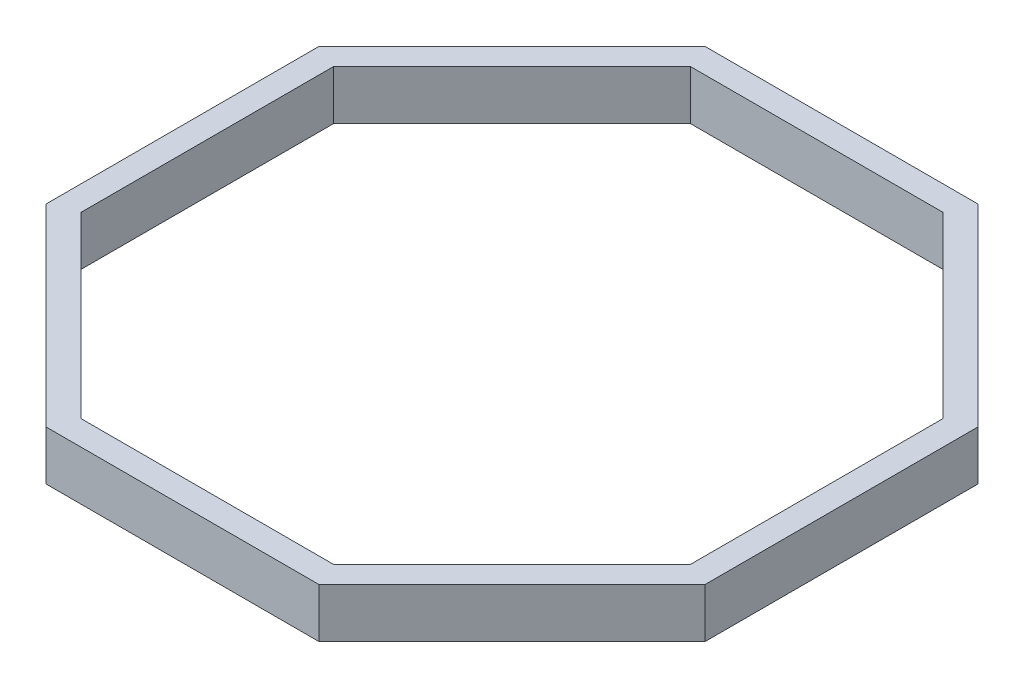
ISO-10303-21;
HEADER;
FILE_DESCRIPTION(('STEP AP214'),'2;1');
FILE_NAME('part.step','',(''),(''),'','','');
FILE_SCHEMA(('AUTOMOTIVE_DESIGN { 1 0 10303 214 1 1 1 1 }'));
ENDSEC;
DATA;
#1=APPLICATION_CONTEXT('core data for automotive mechanical design processes');
#2=APPLICATION_PROTOCOL_DEFINITION('international standard','automotive_design',2000,#1);
#3=PRODUCT_CONTEXT('',#1,'mechanical');
#4=PRODUCT('Part','Part','',(#3));
#5=PRODUCT_RELATED_PRODUCT_CATEGORY('part','',(#4));
#6=PRODUCT_DEFINITION_FORMATION('','',#4);
#7=PRODUCT_DEFINITION_CONTEXT('part definition',#1,'design');
#8=PRODUCT_DEFINITION('design','',#6,#7);
#9=PRODUCT_DEFINITION_SHAPE('','',#8);
#10=(LENGTH_UNIT() NAMED_UNIT(*) SI_UNIT(.MILLI.,.METRE.));
#11=(NAMED_UNIT(*) PLANE_ANGLE_UNIT() SI_UNIT($,.RADIAN.));
#12=(NAMED_UNIT(*) SI_UNIT($,.STERADIAN.) SOLID_ANGLE_UNIT());
#13=UNCERTAINTY_MEASURE_WITH_UNIT(LENGTH_MEASURE(1.E-05),#10,'distance_accuracy_value','');
#14=(GEOMETRIC_REPRESENTATION_CONTEXT(3) GLOBAL_UNCERTAINTY_ASSIGNED_CONTEXT((#13)) GLOBAL_UNIT_ASSIGNED_CONTEXT((#10,
#11,#12)) REPRESENTATION_CONTEXT('',''));
#15=CARTESIAN_POINT('',(0.,0.,0.));
#16=DIRECTION('',(0.,0.,1.));
#17=DIRECTION('',(1.,0.,0.));
#18=AXIS2_PLACEMENT_3D('',#15,#16,#17);
#19=CARTESIAN_POINT('',(200.,30.,82.8427124746187));
#20=DIRECTION('',(-1.,0.,0.));
#21=DIRECTION('',(0.,0.,1.));
#22=AXIS2_PLACEMENT_3D('',#19,#20,#21);
#23=PLANE('',#22);
#24=DIRECTION('',(0.,0.,-1.));
#25=VECTOR('',#24,1.);
#26=CARTESIAN_POINT('',(200.,0.,82.8427124746187));
#27=LINE('',#26,#25);
#28=CARTESIAN_POINT('',(200.,0.,82.8427124746187));
#29=VERTEX_POINT('',#28);
#30=CARTESIAN_POINT('',(199.999999999999,0.,-82.8427124746189));
#31=VERTEX_POINT('',#30);
#32=EDGE_CURVE('E204',#29,#31,#27,.T.);
#33=ORIENTED_EDGE('',*,*,#32,.T.);
#34=DIRECTION('',(0.,-1.,0.));
#35=VECTOR('',#34,1.);
#36=CARTESIAN_POINT('',(199.999999999999,30.,-82.8427124746189));
#37=LINE('',#36,#35);
#38=CARTESIAN_POINT('',(199.999999999999,30.,-82.8427124746189));
#39=VERTEX_POINT('',#38);
#40=EDGE_CURVE('E11',#39,#31,#37,.T.);
#41=ORIENTED_EDGE('',*,*,#40,.F.);
#42=DIRECTION('',(0.,0.,-1.));
#43=VECTOR('',#42,1.);
#44=CARTESIAN_POINT('',(200.,30.,82.8427124746187));
#45=LINE('',#44,#43);
#46=CARTESIAN_POINT('',(200.,30.,82.8427124746187));
#47=VERTEX_POINT('',#46);
#48=EDGE_CURVE('E216',#47,#39,#45,.T.);
#49=ORIENTED_EDGE('',*,*,#48,.F.);
#50=DIRECTION('',(0.,-1.,0.));
#51=VECTOR('',#50,1.);
#52=CARTESIAN_POINT('',(200.,30.,82.8427124746187));
#53=LINE('',#52,#51);
#54=EDGE_CURVE('E234',#47,#29,#53,.T.);
#55=ORIENTED_EDGE('',*,*,#54,.T.);
#56=EDGE_LOOP('',(#33,#41,#49,#55));
#57=FACE_BOUND('',#56,.T.);
#58=ADVANCED_FACE('F35',(#57),#23,.F.);
#59=CARTESIAN_POINT('',(199.999999999999,30.,-82.8427124746189));
#60=DIRECTION('',(-0.707106781186547,0.,0.707106781186548));
#61=DIRECTION('',(0.707106781186548,0.,0.707106781186547));
#62=AXIS2_PLACEMENT_3D('',#59,#60,#61);
#63=PLANE('',#62);
#64=DIRECTION('',(-0.707106781186548,0.,-0.707106781186547));
#65=VECTOR('',#64,1.);
#66=CARTESIAN_POINT('',(199.999999999999,0.,-82.8427124746189));
#67=LINE('',#66,#65);
#68=CARTESIAN_POINT('',(82.8427124746187,0.,-200.));
#69=VERTEX_POINT('',#68);
#70=EDGE_CURVE('E237',#31,#69,#67,.T.);
#71=ORIENTED_EDGE('',*,*,#70,.T.);
#72=DIRECTION('',(0.,-1.,0.));
#73=VECTOR('',#72,1.);
#74=CARTESIAN_POINT('',(82.8427124746187,30.,-200.));
#75=LINE('',#74,#73);
#76=CARTESIAN_POINT('',(82.8427124746187,30.,-200.));
#77=VERTEX_POINT('',#76);
#78=EDGE_CURVE('E42',#77,#69,#75,.T.);
#79=ORIENTED_EDGE('',*,*,#78,.F.);
#80=DIRECTION('',(-0.707106781186548,0.,-0.707106781186547));
#81=VECTOR('',#80,1.);
#82=CARTESIAN_POINT('',(199.999999999999,30.,-82.8427124746189));
#83=LINE('',#82,#81);
#84=EDGE_CURVE('E219',#39,#77,#83,.T.);
#85=ORIENTED_EDGE('',*,*,#84,.F.);
#86=ORIENTED_EDGE('',*,*,#40,.T.);
#87=EDGE_LOOP('',(#71,#79,#85,#86));
#88=FACE_BOUND('',#87,.T.);
#89=ADVANCED_FACE('F292',(#88),#63,.F.);
#90=CARTESIAN_POINT('',(82.8427124746187,30.,-200.));
#91=DIRECTION('',(0.,0.,1.));
#92=DIRECTION('',(1.,0.,0.));
#93=AXIS2_PLACEMENT_3D('',#90,#91,#92);
#94=PLANE('',#93);
#95=DIRECTION('',(-1.,0.,0.));
#96=VECTOR('',#95,1.);
#97=CARTESIAN_POINT('',(82.8427124746187,0.,-200.));
#98=LINE('',#97,#96);
#99=CARTESIAN_POINT('',(-82.8427124746191,0.,-199.999999999999));
#100=VERTEX_POINT('',#99);
#101=EDGE_CURVE('E239',#69,#100,#98,.T.);
#102=ORIENTED_EDGE('',*,*,#101,.T.);
#103=DIRECTION('',(0.,-1.,0.));
#104=VECTOR('',#103,1.);
#105=CARTESIAN_POINT('',(-82.8427124746191,30.,-199.999999999999));
#106=LINE('',#105,#104);
#107=CARTESIAN_POINT('',(-82.8427124746191,30.,-199.999999999999));
#108=VERTEX_POINT('',#107);
#109=EDGE_CURVE('E264',#108,#100,#106,.T.);
#110=ORIENTED_EDGE('',*,*,#109,.F.);
#111=DIRECTION('',(-1.,0.,0.));
#112=VECTOR('',#111,1.);
#113=CARTESIAN_POINT('',(82.8427124746187,30.,-200.));
#114=LINE('',#113,#112);
#115=EDGE_CURVE('E222',#77,#108,#114,.T.);
#116=ORIENTED_EDGE('',*,*,#115,.F.);
#117=ORIENTED_EDGE('',*,*,#78,.T.);
#118=EDGE_LOOP('',(#102,#110,#116,#117));
#119=FACE_BOUND('',#118,.T.);
#120=ADVANCED_FACE('F271',(#119),#94,.F.);
#121=CARTESIAN_POINT('',(-82.8427124746191,30.,-199.999999999999));
#122=DIRECTION('',(0.707106781186548,0.,0.707106781186547));
#123=DIRECTION('',(0.707106781186547,0.,-0.707106781186548));
#124=AXIS2_PLACEMENT_3D('',#121,#122,#123);
#125=PLANE('',#124);
#126=DIRECTION('',(-0.707106781186547,0.,0.707106781186548));
#127=VECTOR('',#126,1.);
#128=CARTESIAN_POINT('',(-82.8427124746191,0.,-199.999999999999));
#129=LINE('',#128,#127);
#130=CARTESIAN_POINT('',(-200.,0.,-82.8427124746187));
#131=VERTEX_POINT('',#130);
#132=EDGE_CURVE('E241',#100,#131,#129,.T.);
#133=ORIENTED_EDGE('',*,*,#132,.T.);
#134=DIRECTION('',(0.,-1.,0.));
#135=VECTOR('',#134,1.);
#136=CARTESIAN_POINT('',(-200.,30.,-82.8427124746187));
#137=LINE('',#136,#135);
#138=CARTESIAN_POINT('',(-200.,30.,-82.8427124746187));
#139=VERTEX_POINT('',#138);
#140=EDGE_CURVE('E261',#139,#131,#137,.T.);
#141=ORIENTED_EDGE('',*,*,#140,.F.);
#142=DIRECTION('',(-0.707106781186547,0.,0.707106781186548));
#143=VECTOR('',#142,1.);
#144=CARTESIAN_POINT('',(-82.8427124746191,30.,-199.999999999999));
#145=LINE('',#144,#143);
#146=EDGE_CURVE('E224',#108,#139,#145,.T.);
#147=ORIENTED_EDGE('',*,*,#146,.F.);
#148=ORIENTED_EDGE('',*,*,#109,.T.);
#149=EDGE_LOOP('',(#133,#141,#147,#148));
#150=FACE_BOUND('',#149,.T.);
#151=ADVANCED_FACE('F280',(#150),#125,.F.);
#152=CARTESIAN_POINT('',(-200.,30.,-82.8427124746187));
#153=DIRECTION('',(1.,0.,0.));
#154=DIRECTION('',(0.,0.,-1.));
#155=AXIS2_PLACEMENT_3D('',#152,#153,#154);
#156=PLANE('',#155);
#157=DIRECTION('',(0.,0.,1.));
#158=VECTOR('',#157,1.);
#159=CARTESIAN_POINT('',(-200.,0.,-82.8427124746187));
#160=LINE('',#159,#158);
#161=CARTESIAN_POINT('',(-199.999999999999,0.,82.842712474619));
#162=VERTEX_POINT('',#161);
#163=EDGE_CURVE('E243',#131,#162,#160,.T.);
#164=ORIENTED_EDGE('',*,*,#163,.T.);
#165=DIRECTION('',(0.,-1.,0.));
#166=VECTOR('',#165,1.);
#167=CARTESIAN_POINT('',(-199.999999999999,30.,82.842712474619));
#168=LINE('',#167,#166);
#169=CARTESIAN_POINT('',(-199.999999999999,30.,82.842712474619));
#170=VERTEX_POINT('',#169);
#171=EDGE_CURVE('E258',#170,#162,#168,.T.);
#172=ORIENTED_EDGE('',*,*,#171,.F.);
#173=DIRECTION('',(0.,0.,1.));
#174=VECTOR('',#173,1.);
#175=CARTESIAN_POINT('',(-200.,30.,-82.8427124746187));
#176=LINE('',#175,#174);
#177=EDGE_CURVE('E226',#139,#170,#176,.T.);
#178=ORIENTED_EDGE('',*,*,#177,.F.);
#179=ORIENTED_EDGE('',*,*,#140,.T.);
#180=EDGE_LOOP('',(#164,#172,#178,#179));
#181=FACE_BOUND('',#180,.T.);
#182=ADVANCED_FACE('F284',(#181),#156,.F.);
#183=CARTESIAN_POINT('',(-199.999999999999,30.,82.842712474619));
#184=DIRECTION('',(0.707106781186547,0.,-0.707106781186548));
#185=DIRECTION('',(-0.707106781186548,0.,-0.707106781186547));
#186=AXIS2_PLACEMENT_3D('',#183,#184,#185);
#187=PLANE('',#186);
#188=DIRECTION('',(0.707106781186548,0.,0.707106781186547));
#189=VECTOR('',#188,1.);
#190=CARTESIAN_POINT('',(-199.999999999999,0.,82.842712474619));
#191=LINE('',#190,#189);
#192=CARTESIAN_POINT('',(-82.8427124746187,0.,200.));
#193=VERTEX_POINT('',#192);
#194=EDGE_CURVE('E245',#162,#193,#191,.T.);
#195=ORIENTED_EDGE('',*,*,#194,.T.);
#196=DIRECTION('',(0.,-1.,0.));
#197=VECTOR('',#196,1.);
#198=CARTESIAN_POINT('',(-82.8427124746187,30.,200.));
#199=LINE('',#198,#197);
#200=CARTESIAN_POINT('',(-82.8427124746187,30.,200.));
#201=VERTEX_POINT('',#200);
#202=EDGE_CURVE('E255',#201,#193,#199,.T.);
#203=ORIENTED_EDGE('',*,*,#202,.F.);
#204=DIRECTION('',(0.707106781186548,0.,0.707106781186547));
#205=VECTOR('',#204,1.);
#206=CARTESIAN_POINT('',(-199.999999999999,30.,82.842712474619));
#207=LINE('',#206,#205);
#208=EDGE_CURVE('E228',#170,#201,#207,.T.);
#209=ORIENTED_EDGE('',*,*,#208,.F.);
#210=ORIENTED_EDGE('',*,*,#171,.T.);
#211=EDGE_LOOP('',(#195,#203,#209,#210));
#212=FACE_BOUND('',#211,.T.);
#213=ADVANCED_FACE('F305',(#212),#187,.F.);
#214=CARTESIAN_POINT('',(-82.8427124746187,30.,200.));
#215=DIRECTION('',(0.,0.,-1.));
#216=DIRECTION('',(-1.,0.,0.));
#217=AXIS2_PLACEMENT_3D('',#214,#215,#216);
#218=PLANE('',#217);
#219=DIRECTION('',(1.,0.,0.));
#220=VECTOR('',#219,1.);
#221=CARTESIAN_POINT('',(-82.8427124746187,0.,200.));
#222=LINE('',#221,#220);
#223=CARTESIAN_POINT('',(82.8427124746189,0.,199.999999999999));
#224=VERTEX_POINT('',#223);
#225=EDGE_CURVE('E247',#193,#224,#222,.T.);
#226=ORIENTED_EDGE('',*,*,#225,.T.);
#227=DIRECTION('',(0.,-1.,0.));
#228=VECTOR('',#227,1.);
#229=CARTESIAN_POINT('',(82.8427124746189,30.,199.999999999999));
#230=LINE('',#229,#228);
#231=CARTESIAN_POINT('',(82.8427124746189,30.,199.999999999999));
#232=VERTEX_POINT('',#231);
#233=EDGE_CURVE('E252',#232,#224,#230,.T.);
#234=ORIENTED_EDGE('',*,*,#233,.F.);
#235=DIRECTION('',(1.,0.,0.));
#236=VECTOR('',#235,1.);
#237=CARTESIAN_POINT('',(-82.8427124746187,30.,200.));
#238=LINE('',#237,#236);
#239=EDGE_CURVE('E230',#201,#232,#238,.T.);
#240=ORIENTED_EDGE('',*,*,#239,.F.);
#241=ORIENTED_EDGE('',*,*,#202,.T.);
#242=EDGE_LOOP('',(#226,#234,#240,#241));
#243=FACE_BOUND('',#242,.T.);
#244=ADVANCED_FACE('F303',(#243),#218,.F.);
#245=CARTESIAN_POINT('',(82.8427124746189,30.,199.999999999999));
#246=DIRECTION('',(-0.707106781186548,0.,-0.707106781186547));
#247=DIRECTION('',(-0.707106781186547,0.,0.707106781186548));
#248=AXIS2_PLACEMENT_3D('',#245,#246,#247);
#249=PLANE('',#248);
#250=DIRECTION('',(0.707106781186547,0.,-0.707106781186548));
#251=VECTOR('',#250,1.);
#252=CARTESIAN_POINT('',(82.8427124746189,0.,199.999999999999));
#253=LINE('',#252,#251);
#254=EDGE_CURVE('E220',#224,#29,#253,.T.);
#255=ORIENTED_EDGE('',*,*,#254,.T.);
#256=ORIENTED_EDGE('',*,*,#54,.F.);
#257=DIRECTION('',(0.707106781186547,0.,-0.707106781186548));
#258=VECTOR('',#257,1.);
#259=CARTESIAN_POINT('',(82.8427124746189,30.,199.999999999999));
#260=LINE('',#259,#258);
#261=EDGE_CURVE('E232',#232,#47,#260,.T.);
#262=ORIENTED_EDGE('',*,*,#261,.F.);
#263=ORIENTED_EDGE('',*,*,#233,.T.);
#264=EDGE_LOOP('',(#255,#256,#262,#263));
#265=FACE_BOUND('',#264,.T.);
#266=ADVANCED_FACE('F298',(#265),#249,.F.);
#267=CARTESIAN_POINT('',(0.,30.,0.));
#268=DIRECTION('',(0.,1.,0.));
#269=DIRECTION('',(0.,0.,1.));
#270=AXIS2_PLACEMENT_3D('',#267,#268,#269);
#271=PLANE('',#270);
#272=DIRECTION('',(0.,0.,-1.));
#273=VECTOR('',#272,1.);
#274=CARTESIAN_POINT('',(185.,30.,76.6295090390226));
#275=LINE('',#274,#273);
#276=CARTESIAN_POINT('',(185.,30.,76.6295090390226));
#277=VERTEX_POINT('',#276);
#278=CARTESIAN_POINT('',(185.,30.,-76.6295090390226));
#279=VERTEX_POINT('',#278);
#280=EDGE_CURVE('E49',#277,#279,#275,.T.);
#281=ORIENTED_EDGE('',*,*,#280,.F.);
#282=DIRECTION('',(0.707106781186547,0.,-0.707106781186548));
#283=VECTOR('',#282,1.);
#284=CARTESIAN_POINT('',(76.6295090390227,30.,185.));
#285=LINE('',#284,#283);
#286=CARTESIAN_POINT('',(76.6295090390227,30.,185.));
#287=VERTEX_POINT('',#286);
#288=EDGE_CURVE('E166',#287,#277,#285,.T.);
#289=ORIENTED_EDGE('',*,*,#288,.F.);
#290=DIRECTION('',(1.,0.,0.));
#291=VECTOR('',#290,1.);
#292=CARTESIAN_POINT('',(-76.6295090390226,30.,185.));
#293=LINE('',#292,#291);
#294=CARTESIAN_POINT('',(-76.6295090390226,30.,185.));
#295=VERTEX_POINT('',#294);
#296=EDGE_CURVE('E169',#295,#287,#293,.T.);
#297=ORIENTED_EDGE('',*,*,#296,.F.);
#298=DIRECTION('',(0.707106781186547,0.,0.707106781186547));
#299=VECTOR('',#298,1.);
#300=CARTESIAN_POINT('',(-185.,30.,76.6295090390226));
#301=LINE('',#300,#299);
#302=CARTESIAN_POINT('',(-185.,30.,76.6295090390226));
#303=VERTEX_POINT('',#302);
#304=EDGE_CURVE('E197',#303,#295,#301,.T.);
#305=ORIENTED_EDGE('',*,*,#304,.F.);
#306=DIRECTION('',(0.,0.,1.));
#307=VECTOR('',#306,1.);
#308=CARTESIAN_POINT('',(-185.,30.,-76.6295090390226));
#309=LINE('',#308,#307);
#310=CARTESIAN_POINT('',(-185.,30.,-76.6295090390226));
#311=VERTEX_POINT('',#310);
#312=EDGE_CURVE('E194',#311,#303,#309,.T.);
#313=ORIENTED_EDGE('',*,*,#312,.F.);
#314=DIRECTION('',(-0.707106781186547,0.,0.707106781186547));
#315=VECTOR('',#314,1.);
#316=CARTESIAN_POINT('',(-76.6295090390226,30.,-185.));
#317=LINE('',#316,#315);
#318=CARTESIAN_POINT('',(-76.6295090390226,30.,-185.));
#319=VERTEX_POINT('',#318);
#320=EDGE_CURVE('E191',#319,#311,#317,.T.);
#321=ORIENTED_EDGE('',*,*,#320,.F.);
#322=DIRECTION('',(-1.,0.,0.));
#323=VECTOR('',#322,1.);
#324=CARTESIAN_POINT('',(76.6295090390225,30.,-185.));
#325=LINE('',#324,#323);
#326=CARTESIAN_POINT('',(76.6295090390225,30.,-185.));
#327=VERTEX_POINT('',#326);
#328=EDGE_CURVE('E188',#327,#319,#325,.T.);
#329=ORIENTED_EDGE('',*,*,#328,.F.);
#330=DIRECTION('',(-0.707106781186548,0.,-0.707106781186548));
#331=VECTOR('',#330,1.);
#332=CARTESIAN_POINT('',(185.,30.,-76.6295090390226));
#333=LINE('',#332,#331);
#334=EDGE_CURVE('E186',#279,#327,#333,.T.);
#335=ORIENTED_EDGE('',*,*,#334,.F.);
#336=EDGE_LOOP('',(#281,#289,#297,#305,#313,#321,#329,#335));
#337=FACE_BOUND('',#336,.T.);
#338=ORIENTED_EDGE('',*,*,#48,.T.);
#339=ORIENTED_EDGE('',*,*,#84,.T.);
#340=ORIENTED_EDGE('',*,*,#115,.T.);
#341=ORIENTED_EDGE('',*,*,#146,.T.);
#342=ORIENTED_EDGE('',*,*,#177,.T.);
#343=ORIENTED_EDGE('',*,*,#208,.T.);
#344=ORIENTED_EDGE('',*,*,#239,.T.);
#345=ORIENTED_EDGE('',*,*,#261,.T.);
#346=EDGE_LOOP('',(#338,#339,#340,#341,#342,#343,#344,#345));
#347=FACE_BOUND('',#346,.T.);
#348=ADVANCED_FACE('F288',(#337,#347),#271,.T.);
#349=CARTESIAN_POINT('',(0.,0.,0.));
#350=DIRECTION('',(0.,1.,0.));
#351=DIRECTION('',(0.,0.,1.));
#352=AXIS2_PLACEMENT_3D('',#349,#350,#351);
#353=PLANE('',#352);
#354=DIRECTION('',(0.707106781186547,0.,-0.707106781186548));
#355=VECTOR('',#354,1.);
#356=CARTESIAN_POINT('',(76.6295090390227,0.,185.));
#357=LINE('',#356,#355);
#358=CARTESIAN_POINT('',(76.6295090390227,0.,185.));
#359=VERTEX_POINT('',#358);
#360=CARTESIAN_POINT('',(185.,0.,76.6295090390226));
#361=VERTEX_POINT('',#360);
#362=EDGE_CURVE('E155',#359,#361,#357,.T.);
#363=ORIENTED_EDGE('',*,*,#362,.T.);
#364=DIRECTION('',(0.,0.,-1.));
#365=VECTOR('',#364,1.);
#366=CARTESIAN_POINT('',(185.,0.,76.6295090390226));
#367=LINE('',#366,#365);
#368=CARTESIAN_POINT('',(185.,0.,-76.6295090390226));
#369=VERTEX_POINT('',#368);
#370=EDGE_CURVE('E149',#361,#369,#367,.T.);
#371=ORIENTED_EDGE('',*,*,#370,.T.);
#372=DIRECTION('',(-0.707106781186548,0.,-0.707106781186548));
#373=VECTOR('',#372,1.);
#374=CARTESIAN_POINT('',(185.,0.,-76.6295090390226));
#375=LINE('',#374,#373);
#376=CARTESIAN_POINT('',(76.6295090390225,0.,-185.));
#377=VERTEX_POINT('',#376);
#378=EDGE_CURVE('E158',#369,#377,#375,.T.);
#379=ORIENTED_EDGE('',*,*,#378,.T.);
#380=DIRECTION('',(-1.,0.,0.));
#381=VECTOR('',#380,1.);
#382=CARTESIAN_POINT('',(76.6295090390225,0.,-185.));
#383=LINE('',#382,#381);
#384=CARTESIAN_POINT('',(-76.6295090390226,0.,-185.));
#385=VERTEX_POINT('',#384);
#386=EDGE_CURVE('E57',#377,#385,#383,.T.);
#387=ORIENTED_EDGE('',*,*,#386,.T.);
#388=DIRECTION('',(-0.707106781186547,0.,0.707106781186547));
#389=VECTOR('',#388,1.);
#390=CARTESIAN_POINT('',(-76.6295090390226,0.,-185.));
#391=LINE('',#390,#389);
#392=CARTESIAN_POINT('',(-185.,0.,-76.6295090390226));
#393=VERTEX_POINT('',#392);
#394=EDGE_CURVE('E173',#385,#393,#391,.T.);
#395=ORIENTED_EDGE('',*,*,#394,.T.);
#396=DIRECTION('',(0.,0.,1.));
#397=VECTOR('',#396,1.);
#398=CARTESIAN_POINT('',(-185.,0.,-76.6295090390226));
#399=LINE('',#398,#397);
#400=CARTESIAN_POINT('',(-185.,0.,76.6295090390226));
#401=VERTEX_POINT('',#400);
#402=EDGE_CURVE('E176',#393,#401,#399,.T.);
#403=ORIENTED_EDGE('',*,*,#402,.T.);
#404=DIRECTION('',(0.707106781186547,0.,0.707106781186547));
#405=VECTOR('',#404,1.);
#406=CARTESIAN_POINT('',(-185.,0.,76.6295090390226));
#407=LINE('',#406,#405);
#408=CARTESIAN_POINT('',(-76.6295090390226,0.,185.));
#409=VERTEX_POINT('',#408);
#410=EDGE_CURVE('E179',#401,#409,#407,.T.);
#411=ORIENTED_EDGE('',*,*,#410,.T.);
#412=DIRECTION('',(1.,0.,0.));
#413=VECTOR('',#412,1.);
#414=CARTESIAN_POINT('',(-76.6295090390226,0.,185.));
#415=LINE('',#414,#413);
#416=EDGE_CURVE('E182',#409,#359,#415,.T.);
#417=ORIENTED_EDGE('',*,*,#416,.T.);
#418=EDGE_LOOP('',(#363,#371,#379,#387,#395,#403,#411,#417));
#419=FACE_BOUND('',#418,.T.);
#420=ORIENTED_EDGE('',*,*,#32,.F.);
#421=ORIENTED_EDGE('',*,*,#254,.F.);
#422=ORIENTED_EDGE('',*,*,#225,.F.);
#423=ORIENTED_EDGE('',*,*,#194,.F.);
#424=ORIENTED_EDGE('',*,*,#163,.F.);
#425=ORIENTED_EDGE('',*,*,#132,.F.);
#426=ORIENTED_EDGE('',*,*,#101,.F.);
#427=ORIENTED_EDGE('',*,*,#70,.F.);
#428=EDGE_LOOP('',(#420,#421,#422,#423,#424,#425,#426,#427));
#429=FACE_BOUND('',#428,.T.);
#430=ADVANCED_FACE('F162',(#419,#429),#353,.F.);
#431=CARTESIAN_POINT('',(185.,0.,76.6295090390226));
#432=DIRECTION('',(1.,0.,0.));
#433=DIRECTION('',(0.,0.,-1.));
#434=AXIS2_PLACEMENT_3D('',#431,#432,#433);
#435=PLANE('',#434);
#436=ORIENTED_EDGE('',*,*,#280,.T.);
#437=DIRECTION('',(0.,1.,0.));
#438=VECTOR('',#437,1.);
#439=CARTESIAN_POINT('',(185.,0.,-76.6295090390226));
#440=LINE('',#439,#438);
#441=EDGE_CURVE('E145',#369,#279,#440,.T.);
#442=ORIENTED_EDGE('',*,*,#441,.F.);
#443=ORIENTED_EDGE('',*,*,#370,.F.);
#444=DIRECTION('',(0.,1.,0.));
#445=VECTOR('',#444,1.);
#446=CARTESIAN_POINT('',(185.,0.,76.6295090390226));
#447=LINE('',#446,#445);
#448=EDGE_CURVE('E202',#361,#277,#447,.T.);
#449=ORIENTED_EDGE('',*,*,#448,.T.);
#450=EDGE_LOOP('',(#436,#442,#443,#449));
#451=FACE_BOUND('',#450,.T.);
#452=ADVANCED_FACE('F147',(#451),#435,.F.);
#453=CARTESIAN_POINT('',(76.6295090390227,0.,185.));
#454=DIRECTION('',(0.707106781186548,0.,0.707106781186547));
#455=DIRECTION('',(0.707106781186547,0.,-0.707106781186548));
#456=AXIS2_PLACEMENT_3D('',#453,#454,#455);
#457=PLANE('',#456);
#458=ORIENTED_EDGE('',*,*,#288,.T.);
#459=ORIENTED_EDGE('',*,*,#448,.F.);
#460=ORIENTED_EDGE('',*,*,#362,.F.);
#461=DIRECTION('',(0.,1.,0.));
#462=VECTOR('',#461,1.);
#463=CARTESIAN_POINT('',(76.6295090390227,0.,185.));
#464=LINE('',#463,#462);
#465=EDGE_CURVE('E205',#359,#287,#464,.T.);
#466=ORIENTED_EDGE('',*,*,#465,.T.);
#467=EDGE_LOOP('',(#458,#459,#460,#466));
#468=FACE_BOUND('',#467,.T.);
#469=ADVANCED_FACE('F376',(#468),#457,.F.);
#470=CARTESIAN_POINT('',(-76.6295090390226,0.,185.));
#471=DIRECTION('',(0.,0.,1.));
#472=DIRECTION('',(1.,0.,0.));
#473=AXIS2_PLACEMENT_3D('',#470,#471,#472);
#474=PLANE('',#473);
#475=ORIENTED_EDGE('',*,*,#296,.T.);
#476=ORIENTED_EDGE('',*,*,#465,.F.);
#477=ORIENTED_EDGE('',*,*,#416,.F.);
#478=DIRECTION('',(0.,1.,0.));
#479=VECTOR('',#478,1.);
#480=CARTESIAN_POINT('',(-76.6295090390226,0.,185.));
#481=LINE('',#480,#479);
#482=EDGE_CURVE('E207',#409,#295,#481,.T.);
#483=ORIENTED_EDGE('',*,*,#482,.T.);
#484=EDGE_LOOP('',(#475,#476,#477,#483));
#485=FACE_BOUND('',#484,.T.);
#486=ADVANCED_FACE('F385',(#485),#474,.F.);
#487=CARTESIAN_POINT('',(-185.,0.,76.6295090390226));
#488=DIRECTION('',(-0.707106781186547,0.,0.707106781186547));
#489=DIRECTION('',(0.707106781186548,0.,0.707106781186548));
#490=AXIS2_PLACEMENT_3D('',#487,#488,#489);
#491=PLANE('',#490);
#492=ORIENTED_EDGE('',*,*,#304,.T.);
#493=ORIENTED_EDGE('',*,*,#482,.F.);
#494=ORIENTED_EDGE('',*,*,#410,.F.);
#495=DIRECTION('',(0.,1.,0.));
#496=VECTOR('',#495,1.);
#497=CARTESIAN_POINT('',(-185.,0.,76.6295090390226));
#498=LINE('',#497,#496);
#499=EDGE_CURVE('E209',#401,#303,#498,.T.);
#500=ORIENTED_EDGE('',*,*,#499,.T.);
#501=EDGE_LOOP('',(#492,#493,#494,#500));
#502=FACE_BOUND('',#501,.T.);
#503=ADVANCED_FACE('F395',(#502),#491,.F.);
#504=CARTESIAN_POINT('',(-185.,0.,-76.6295090390226));
#505=DIRECTION('',(-1.,0.,0.));
#506=DIRECTION('',(0.,0.,1.));
#507=AXIS2_PLACEMENT_3D('',#504,#505,#506);
#508=PLANE('',#507);
#509=ORIENTED_EDGE('',*,*,#312,.T.);
#510=ORIENTED_EDGE('',*,*,#499,.F.);
#511=ORIENTED_EDGE('',*,*,#402,.F.);
#512=DIRECTION('',(0.,1.,0.));
#513=VECTOR('',#512,1.);
#514=CARTESIAN_POINT('',(-185.,0.,-76.6295090390226));
#515=LINE('',#514,#513);
#516=EDGE_CURVE('E211',#393,#311,#515,.T.);
#517=ORIENTED_EDGE('',*,*,#516,.T.);
#518=EDGE_LOOP('',(#509,#510,#511,#517));
#519=FACE_BOUND('',#518,.T.);
#520=ADVANCED_FACE('F405',(#519),#508,.F.);
#521=CARTESIAN_POINT('',(-76.6295090390226,0.,-185.));
#522=DIRECTION('',(-0.707106781186547,0.,-0.707106781186547));
#523=DIRECTION('',(-0.707106781186548,0.,0.707106781186548));
#524=AXIS2_PLACEMENT_3D('',#521,#522,#523);
#525=PLANE('',#524);
#526=ORIENTED_EDGE('',*,*,#320,.T.);
#527=ORIENTED_EDGE('',*,*,#516,.F.);
#528=ORIENTED_EDGE('',*,*,#394,.F.);
#529=DIRECTION('',(0.,1.,0.));
#530=VECTOR('',#529,1.);
#531=CARTESIAN_POINT('',(-76.6295090390226,0.,-185.));
#532=LINE('',#531,#530);
#533=EDGE_CURVE('E213',#385,#319,#532,.T.);
#534=ORIENTED_EDGE('',*,*,#533,.T.);
#535=EDGE_LOOP('',(#526,#527,#528,#534));
#536=FACE_BOUND('',#535,.T.);
#537=ADVANCED_FACE('F415',(#536),#525,.F.);
#538=CARTESIAN_POINT('',(76.6295090390225,0.,-185.));
#539=DIRECTION('',(0.,0.,-1.));
#540=DIRECTION('',(-1.,0.,0.));
#541=AXIS2_PLACEMENT_3D('',#538,#539,#540);
#542=PLANE('',#541);
#543=ORIENTED_EDGE('',*,*,#328,.T.);
#544=ORIENTED_EDGE('',*,*,#533,.F.);
#545=ORIENTED_EDGE('',*,*,#386,.F.);
#546=DIRECTION('',(0.,1.,0.));
#547=VECTOR('',#546,1.);
#548=CARTESIAN_POINT('',(76.6295090390225,0.,-185.));
#549=LINE('',#548,#547);
#550=EDGE_CURVE('E154',#377,#327,#549,.T.);
#551=ORIENTED_EDGE('',*,*,#550,.T.);
#552=EDGE_LOOP('',(#543,#544,#545,#551));
#553=FACE_BOUND('',#552,.T.);
#554=ADVANCED_FACE('F425',(#553),#542,.F.);
#555=CARTESIAN_POINT('',(185.,0.,-76.6295090390226));
#556=DIRECTION('',(0.707106781186547,0.,-0.707106781186548));
#557=DIRECTION('',(-0.707106781186548,0.,-0.707106781186547));
#558=AXIS2_PLACEMENT_3D('',#555,#556,#557);
#559=PLANE('',#558);
#560=ORIENTED_EDGE('',*,*,#334,.T.);
#561=ORIENTED_EDGE('',*,*,#550,.F.);
#562=ORIENTED_EDGE('',*,*,#378,.F.);
#563=ORIENTED_EDGE('',*,*,#441,.T.);
#564=EDGE_LOOP('',(#560,#561,#562,#563));
#565=FACE_BOUND('',#564,.T.);
#566=ADVANCED_FACE('F159',(#565),#559,.F.);
#567=CLOSED_SHELL('',(#58,#89,#120,#151,#182,#213,#244,#266,#348,#430,#452,#469,#486,#503,#520,
#537,#554,#566));
#568=MANIFOLD_SOLID_BREP('B2',#567);
#569=ADVANCED_BREP_SHAPE_REPRESENTATION('',(#18,#568),#14);
#570=SHAPE_DEFINITION_REPRESENTATION(#9,#569);
ENDSEC;
END-ISO-10303-21;
